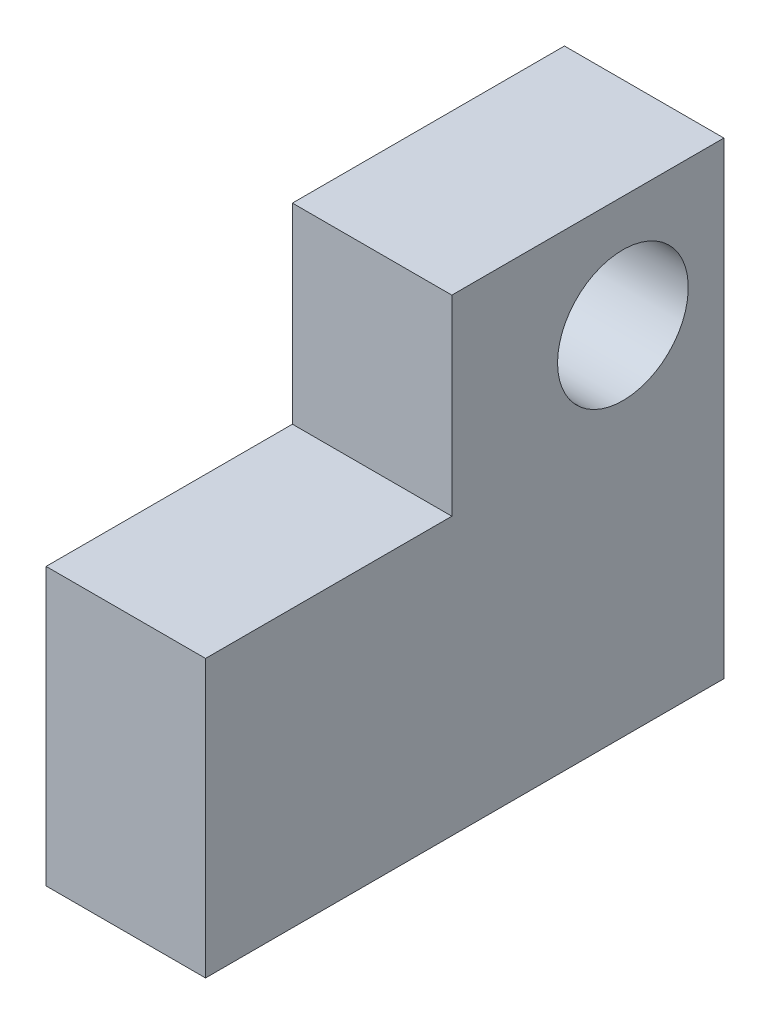
ISO-10303-21;
HEADER;
FILE_DESCRIPTION(('STEP AP214'),'2;1');
FILE_NAME('part.step','',(''),(''),'','','');
FILE_SCHEMA(('AUTOMOTIVE_DESIGN { 1 0 10303 214 1 1 1 1 }'));
ENDSEC;
DATA;
#1=APPLICATION_CONTEXT('core data for automotive mechanical design processes');
#2=APPLICATION_PROTOCOL_DEFINITION('international standard','automotive_design',2000,#1);
#3=PRODUCT_CONTEXT('',#1,'mechanical');
#4=PRODUCT('Part','Part','',(#3));
#5=PRODUCT_RELATED_PRODUCT_CATEGORY('part','',(#4));
#6=PRODUCT_DEFINITION_FORMATION('','',#4);
#7=PRODUCT_DEFINITION_CONTEXT('part definition',#1,'design');
#8=PRODUCT_DEFINITION('design','',#6,#7);
#9=PRODUCT_DEFINITION_SHAPE('','',#8);
#10=(LENGTH_UNIT() NAMED_UNIT(*) SI_UNIT(.MILLI.,.METRE.));
#11=(NAMED_UNIT(*) PLANE_ANGLE_UNIT() SI_UNIT($,.RADIAN.));
#12=(NAMED_UNIT(*) SI_UNIT($,.STERADIAN.) SOLID_ANGLE_UNIT());
#13=UNCERTAINTY_MEASURE_WITH_UNIT(LENGTH_MEASURE(1.E-05),#10,'distance_accuracy_value','');
#14=(GEOMETRIC_REPRESENTATION_CONTEXT(3) GLOBAL_UNCERTAINTY_ASSIGNED_CONTEXT((#13)) GLOBAL_UNIT_ASSIGNED_CONTEXT((#10,
#11,#12)) REPRESENTATION_CONTEXT('',''));
#15=CARTESIAN_POINT('',(0.,0.,0.));
#16=DIRECTION('',(0.,0.,1.));
#17=DIRECTION('',(1.,0.,0.));
#18=AXIS2_PLACEMENT_3D('',#15,#16,#17);
#19=CARTESIAN_POINT('',(-10.4034990025154,0.,0.));
#20=DIRECTION('',(-1.,0.,0.));
#21=DIRECTION('',(0.,0.,1.));
#22=AXIS2_PLACEMENT_3D('',#19,#20,#21);
#23=PLANE('',#22);
#24=DIRECTION('',(0.,0.,-1.));
#25=VECTOR('',#24,1.);
#26=CARTESIAN_POINT('',(-10.4034990025154,45.0689278229734,20.5971793938289));
#27=LINE('',#26,#25);
#28=CARTESIAN_POINT('',(-10.4034990025154,45.0689278229734,20.5971793938289));
#29=VERTEX_POINT('',#28);
#30=CARTESIAN_POINT('',(-10.4034990025154,45.0689278229734,-4.99999999999999));
#31=VERTEX_POINT('',#30);
#32=EDGE_CURVE('E147',#29,#31,#27,.T.);
#33=ORIENTED_EDGE('',*,*,#32,.T.);
#34=DIRECTION('',(0.,-1.,0.));
#35=VECTOR('',#34,1.);
#36=CARTESIAN_POINT('',(-10.4034990025154,45.0689278229734,-4.99999999999999));
#37=LINE('',#36,#35);
#38=CARTESIAN_POINT('',(-10.4034990025154,1.01073851489599,-4.99999999999999));
#39=VERTEX_POINT('',#38);
#40=EDGE_CURVE('E98',#31,#39,#37,.T.);
#41=ORIENTED_EDGE('',*,*,#40,.T.);
#42=DIRECTION('',(0.,0.,1.));
#43=VECTOR('',#42,1.);
#44=CARTESIAN_POINT('',(-10.4034990025154,1.01073851489599,-4.99999999999999));
#45=LINE('',#44,#43);
#46=CARTESIAN_POINT('',(-10.4034990025154,1.01073851489599,43.7723109129037));
#47=VERTEX_POINT('',#46);
#48=EDGE_CURVE('E112',#39,#47,#45,.T.);
#49=ORIENTED_EDGE('',*,*,#48,.T.);
#50=DIRECTION('',(0.,1.,0.));
#51=VECTOR('',#50,1.);
#52=CARTESIAN_POINT('',(-10.4034990025154,1.01073851489599,43.7723109129037));
#53=LINE('',#52,#51);
#54=CARTESIAN_POINT('',(-10.4034990025154,27.0510790926505,43.7723109129037));
#55=VERTEX_POINT('',#54);
#56=EDGE_CURVE('E106',#47,#55,#53,.T.);
#57=ORIENTED_EDGE('',*,*,#56,.T.);
#58=DIRECTION('',(0.,0.,-1.));
#59=VECTOR('',#58,1.);
#60=CARTESIAN_POINT('',(-10.4034990025154,27.0510790926505,43.7723109129037));
#61=LINE('',#60,#59);
#62=CARTESIAN_POINT('',(-10.4034990025154,27.0510790926505,20.5971793938289));
#63=VERTEX_POINT('',#62);
#64=EDGE_CURVE('E109',#55,#63,#61,.T.);
#65=ORIENTED_EDGE('',*,*,#64,.T.);
#66=DIRECTION('',(0.,1.,0.));
#67=VECTOR('',#66,1.);
#68=CARTESIAN_POINT('',(-10.4034990025154,27.0510790926505,20.5971793938289));
#69=LINE('',#68,#67);
#70=EDGE_CURVE('E61',#63,#29,#69,.T.);
#71=ORIENTED_EDGE('',*,*,#70,.T.);
#72=EDGE_LOOP('',(#33,#41,#49,#57,#65,#71));
#73=FACE_BOUND('',#72,.T.);
#74=CARTESIAN_POINT('',(-10.4034990025154,34.5689278229734,4.50000000000002));
#75=DIRECTION('',(-1.,0.,0.));
#76=DIRECTION('',(0.,0.,1.));
#77=AXIS2_PLACEMENT_3D('',#74,#75,#76);
#78=CIRCLE('',#77,6.15);
#79=CARTESIAN_POINT('',(-10.4034990025154,34.5689278229734,10.65));
#80=VERTEX_POINT('',#79);
#81=EDGE_CURVE('E137',#80,#80,#78,.T.);
#82=ORIENTED_EDGE('',*,*,#81,.F.);
#83=EDGE_LOOP('',(#82));
#84=FACE_BOUND('',#83,.T.);
#85=ADVANCED_FACE('F41',(#73,#84),#23,.T.);
#86=CARTESIAN_POINT('',(4.59650099748462,0.,0.));
#87=DIRECTION('',(-1.,0.,0.));
#88=DIRECTION('',(0.,0.,1.));
#89=AXIS2_PLACEMENT_3D('',#86,#87,#88);
#90=PLANE('',#89);
#91=CARTESIAN_POINT('',(4.59650099748462,34.5689278229734,4.50000000000002));
#92=DIRECTION('',(-1.,0.,0.));
#93=DIRECTION('',(0.,0.,1.));
#94=AXIS2_PLACEMENT_3D('',#91,#92,#93);
#95=CIRCLE('',#94,6.15);
#96=CARTESIAN_POINT('',(4.59650099748462,34.5689278229734,10.65));
#97=VERTEX_POINT('',#96);
#98=EDGE_CURVE('E52',#97,#97,#95,.T.);
#99=ORIENTED_EDGE('',*,*,#98,.T.);
#100=EDGE_LOOP('',(#99));
#101=FACE_BOUND('',#100,.T.);
#102=DIRECTION('',(0.,0.,-1.));
#103=VECTOR('',#102,1.);
#104=CARTESIAN_POINT('',(4.59650099748462,45.0689278229734,20.5971793938289));
#105=LINE('',#104,#103);
#106=CARTESIAN_POINT('',(4.59650099748462,45.0689278229734,20.5971793938289));
#107=VERTEX_POINT('',#106);
#108=CARTESIAN_POINT('',(4.59650099748462,45.0689278229734,-4.99999999999999));
#109=VERTEX_POINT('',#108);
#110=EDGE_CURVE('E132',#107,#109,#105,.T.);
#111=ORIENTED_EDGE('',*,*,#110,.F.);
#112=DIRECTION('',(0.,1.,0.));
#113=VECTOR('',#112,1.);
#114=CARTESIAN_POINT('',(4.59650099748462,27.0510790926505,20.5971793938289));
#115=LINE('',#114,#113);
#116=CARTESIAN_POINT('',(4.59650099748462,27.0510790926505,20.5971793938289));
#117=VERTEX_POINT('',#116);
#118=EDGE_CURVE('E89',#117,#107,#115,.T.);
#119=ORIENTED_EDGE('',*,*,#118,.F.);
#120=DIRECTION('',(0.,0.,-1.));
#121=VECTOR('',#120,1.);
#122=CARTESIAN_POINT('',(4.59650099748462,27.0510790926505,43.7723109129037));
#123=LINE('',#122,#121);
#124=CARTESIAN_POINT('',(4.59650099748462,27.0510790926505,43.7723109129037));
#125=VERTEX_POINT('',#124);
#126=EDGE_CURVE('E11',#125,#117,#123,.T.);
#127=ORIENTED_EDGE('',*,*,#126,.F.);
#128=DIRECTION('',(0.,1.,0.));
#129=VECTOR('',#128,1.);
#130=CARTESIAN_POINT('',(4.59650099748462,1.01073851489599,43.7723109129037));
#131=LINE('',#130,#129);
#132=CARTESIAN_POINT('',(4.59650099748462,1.01073851489599,43.7723109129037));
#133=VERTEX_POINT('',#132);
#134=EDGE_CURVE('E82',#133,#125,#131,.T.);
#135=ORIENTED_EDGE('',*,*,#134,.F.);
#136=DIRECTION('',(0.,0.,1.));
#137=VECTOR('',#136,1.);
#138=CARTESIAN_POINT('',(4.59650099748462,1.01073851489599,-4.99999999999999));
#139=LINE('',#138,#137);
#140=CARTESIAN_POINT('',(4.59650099748462,1.01073851489599,-4.99999999999999));
#141=VERTEX_POINT('',#140);
#142=EDGE_CURVE('E140',#141,#133,#139,.T.);
#143=ORIENTED_EDGE('',*,*,#142,.F.);
#144=DIRECTION('',(0.,-1.,0.));
#145=VECTOR('',#144,1.);
#146=CARTESIAN_POINT('',(4.59650099748462,45.0689278229734,-4.99999999999999));
#147=LINE('',#146,#145);
#148=EDGE_CURVE('E136',#109,#141,#147,.T.);
#149=ORIENTED_EDGE('',*,*,#148,.F.);
#150=EDGE_LOOP('',(#111,#119,#127,#135,#143,#149));
#151=FACE_BOUND('',#150,.T.);
#152=ADVANCED_FACE('F178',(#101,#151),#90,.F.);
#153=CARTESIAN_POINT('',(-10.4034990025154,45.0689278229734,20.5971793938289));
#154=DIRECTION('',(0.,-1.,0.));
#155=DIRECTION('',(0.,0.,-1.));
#156=AXIS2_PLACEMENT_3D('',#153,#154,#155);
#157=PLANE('',#156);
#158=ORIENTED_EDGE('',*,*,#110,.T.);
#159=DIRECTION('',(1.,0.,0.));
#160=VECTOR('',#159,1.);
#161=CARTESIAN_POINT('',(-10.4034990025154,45.0689278229734,-4.99999999999999));
#162=LINE('',#161,#160);
#163=EDGE_CURVE('E45',#31,#109,#162,.T.);
#164=ORIENTED_EDGE('',*,*,#163,.F.);
#165=ORIENTED_EDGE('',*,*,#32,.F.);
#166=DIRECTION('',(1.,0.,0.));
#167=VECTOR('',#166,1.);
#168=CARTESIAN_POINT('',(-10.4034990025154,45.0689278229734,20.5971793938289));
#169=LINE('',#168,#167);
#170=EDGE_CURVE('E128',#29,#107,#169,.T.);
#171=ORIENTED_EDGE('',*,*,#170,.T.);
#172=EDGE_LOOP('',(#158,#164,#165,#171));
#173=FACE_BOUND('',#172,.T.);
#174=ADVANCED_FACE('F43',(#173),#157,.F.);
#175=CARTESIAN_POINT('',(-10.4034990025154,45.0689278229734,-4.99999999999999));
#176=DIRECTION('',(0.,0.,1.));
#177=DIRECTION('',(0.,-1.,0.));
#178=AXIS2_PLACEMENT_3D('',#175,#176,#177);
#179=PLANE('',#178);
#180=ORIENTED_EDGE('',*,*,#148,.T.);
#181=DIRECTION('',(1.,0.,0.));
#182=VECTOR('',#181,1.);
#183=CARTESIAN_POINT('',(-10.4034990025154,1.01073851489599,-4.99999999999999));
#184=LINE('',#183,#182);
#185=EDGE_CURVE('E153',#39,#141,#184,.T.);
#186=ORIENTED_EDGE('',*,*,#185,.F.);
#187=ORIENTED_EDGE('',*,*,#40,.F.);
#188=ORIENTED_EDGE('',*,*,#163,.T.);
#189=EDGE_LOOP('',(#180,#186,#187,#188));
#190=FACE_BOUND('',#189,.T.);
#191=ADVANCED_FACE('F195',(#190),#179,.F.);
#192=CARTESIAN_POINT('',(-10.4034990025154,1.01073851489599,-4.99999999999999));
#193=DIRECTION('',(0.,1.,0.));
#194=DIRECTION('',(0.,0.,1.));
#195=AXIS2_PLACEMENT_3D('',#192,#193,#194);
#196=PLANE('',#195);
#197=ORIENTED_EDGE('',*,*,#142,.T.);
#198=DIRECTION('',(1.,0.,0.));
#199=VECTOR('',#198,1.);
#200=CARTESIAN_POINT('',(-10.4034990025154,1.01073851489599,43.7723109129037));
#201=LINE('',#200,#199);
#202=EDGE_CURVE('E121',#47,#133,#201,.T.);
#203=ORIENTED_EDGE('',*,*,#202,.F.);
#204=ORIENTED_EDGE('',*,*,#48,.F.);
#205=ORIENTED_EDGE('',*,*,#185,.T.);
#206=EDGE_LOOP('',(#197,#203,#204,#205));
#207=FACE_BOUND('',#206,.T.);
#208=ADVANCED_FACE('F193',(#207),#196,.F.);
#209=CARTESIAN_POINT('',(-10.4034990025154,1.01073851489599,43.7723109129037));
#210=DIRECTION('',(0.,0.,-1.));
#211=DIRECTION('',(-1.,0.,0.));
#212=AXIS2_PLACEMENT_3D('',#209,#210,#211);
#213=PLANE('',#212);
#214=ORIENTED_EDGE('',*,*,#134,.T.);
#215=DIRECTION('',(1.,0.,0.));
#216=VECTOR('',#215,1.);
#217=CARTESIAN_POINT('',(-10.4034990025154,27.0510790926505,43.7723109129037));
#218=LINE('',#217,#216);
#219=EDGE_CURVE('E117',#55,#125,#218,.T.);
#220=ORIENTED_EDGE('',*,*,#219,.F.);
#221=ORIENTED_EDGE('',*,*,#56,.F.);
#222=ORIENTED_EDGE('',*,*,#202,.T.);
#223=EDGE_LOOP('',(#214,#220,#221,#222));
#224=FACE_BOUND('',#223,.T.);
#225=ADVANCED_FACE('F118',(#224),#213,.F.);
#226=CARTESIAN_POINT('',(-10.4034990025154,27.0510790926505,43.7723109129037));
#227=DIRECTION('',(0.,-1.,0.));
#228=DIRECTION('',(0.,0.,-1.));
#229=AXIS2_PLACEMENT_3D('',#226,#227,#228);
#230=PLANE('',#229);
#231=ORIENTED_EDGE('',*,*,#219,.T.);
#232=ORIENTED_EDGE('',*,*,#126,.T.);
#233=DIRECTION('',(1.,0.,0.));
#234=VECTOR('',#233,1.);
#235=CARTESIAN_POINT('',(-10.4034990025154,27.0510790926505,20.5971793938289));
#236=LINE('',#235,#234);
#237=EDGE_CURVE('E122',#63,#117,#236,.T.);
#238=ORIENTED_EDGE('',*,*,#237,.F.);
#239=ORIENTED_EDGE('',*,*,#64,.F.);
#240=EDGE_LOOP('',(#231,#232,#238,#239));
#241=FACE_BOUND('',#240,.T.);
#242=ADVANCED_FACE('F124',(#241),#230,.F.);
#243=CARTESIAN_POINT('',(-10.4034990025154,27.0510790926505,20.5971793938289));
#244=DIRECTION('',(0.,0.,-1.));
#245=DIRECTION('',(-1.,0.,0.));
#246=AXIS2_PLACEMENT_3D('',#243,#244,#245);
#247=PLANE('',#246);
#248=ORIENTED_EDGE('',*,*,#118,.T.);
#249=ORIENTED_EDGE('',*,*,#170,.F.);
#250=ORIENTED_EDGE('',*,*,#70,.F.);
#251=ORIENTED_EDGE('',*,*,#237,.T.);
#252=EDGE_LOOP('',(#248,#249,#250,#251));
#253=FACE_BOUND('',#252,.T.);
#254=ADVANCED_FACE('F186',(#253),#247,.F.);
#255=CARTESIAN_POINT('',(-10.4034990025154,34.5689278229734,4.50000000000002));
#256=DIRECTION('',(1.,0.,0.));
#257=DIRECTION('',(0.,0.,-1.));
#258=AXIS2_PLACEMENT_3D('',#255,#256,#257);
#259=CYLINDRICAL_SURFACE('',#258,6.15);
#260=ORIENTED_EDGE('',*,*,#81,.T.);
#261=EDGE_LOOP('',(#260));
#262=FACE_BOUND('',#261,.T.);
#263=ORIENTED_EDGE('',*,*,#98,.F.);
#264=EDGE_LOOP('',(#263));
#265=FACE_BOUND('',#264,.T.);
#266=ADVANCED_FACE('F175',(#262,#265),#259,.F.);
#267=CLOSED_SHELL('',(#85,#152,#174,#191,#208,#225,#242,#254,#266));
#268=MANIFOLD_SOLID_BREP('B2',#267);
#269=ADVANCED_BREP_SHAPE_REPRESENTATION('',(#18,#268),#14);
#270=SHAPE_DEFINITION_REPRESENTATION(#9,#269);
ENDSEC;
END-ISO-10303-21;
